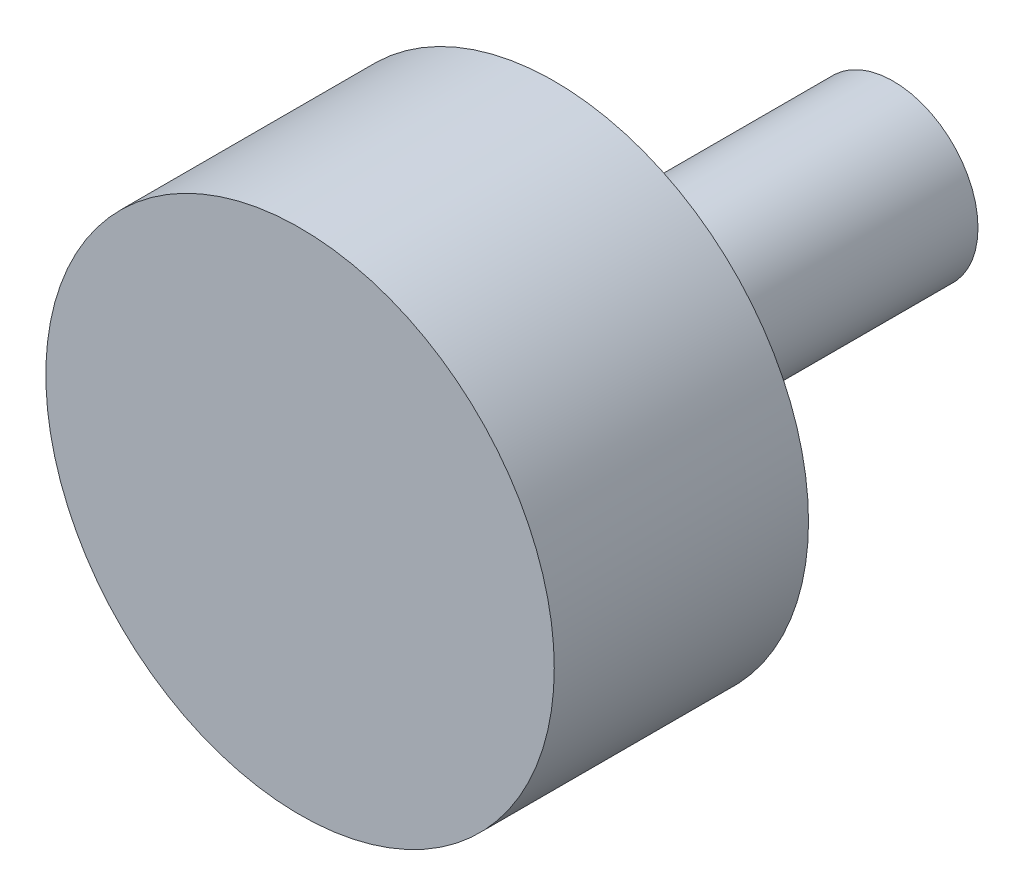
ISO-10303-21;
HEADER;
FILE_DESCRIPTION(('STEP AP214'),'2;1');
FILE_NAME('part.step','',(''),(''),'','','');
FILE_SCHEMA(('AUTOMOTIVE_DESIGN { 1 0 10303 214 1 1 1 1 }'));
ENDSEC;
DATA;
#1=APPLICATION_CONTEXT('core data for automotive mechanical design processes');
#2=APPLICATION_PROTOCOL_DEFINITION('international standard','automotive_design',2000,#1);
#3=PRODUCT_CONTEXT('',#1,'mechanical');
#4=PRODUCT('Part','Part','',(#3));
#5=PRODUCT_RELATED_PRODUCT_CATEGORY('part','',(#4));
#6=PRODUCT_DEFINITION_FORMATION('','',#4);
#7=PRODUCT_DEFINITION_CONTEXT('part definition',#1,'design');
#8=PRODUCT_DEFINITION('design','',#6,#7);
#9=PRODUCT_DEFINITION_SHAPE('','',#8);
#10=(LENGTH_UNIT() NAMED_UNIT(*) SI_UNIT(.MILLI.,.METRE.));
#11=(NAMED_UNIT(*) PLANE_ANGLE_UNIT() SI_UNIT($,.RADIAN.));
#12=(NAMED_UNIT(*) SI_UNIT($,.STERADIAN.) SOLID_ANGLE_UNIT());
#13=UNCERTAINTY_MEASURE_WITH_UNIT(LENGTH_MEASURE(1.E-05),#10,'distance_accuracy_value','');
#14=(GEOMETRIC_REPRESENTATION_CONTEXT(3) GLOBAL_UNCERTAINTY_ASSIGNED_CONTEXT((#13)) GLOBAL_UNIT_ASSIGNED_CONTEXT((#10,
#11,#12)) REPRESENTATION_CONTEXT('',''));
#15=CARTESIAN_POINT('',(0.,0.,0.));
#16=DIRECTION('',(0.,0.,1.));
#17=DIRECTION('',(1.,0.,0.));
#18=AXIS2_PLACEMENT_3D('',#15,#16,#17);
#19=CARTESIAN_POINT('',(0.,0.,-508.));
#20=DIRECTION('',(0.,0.,1.));
#21=DIRECTION('',(1.,0.,0.));
#22=AXIS2_PLACEMENT_3D('',#19,#20,#21);
#23=CYLINDRICAL_SURFACE('',#22,127.);
#24=CARTESIAN_POINT('',(0.,0.,-508.));
#25=DIRECTION('',(0.,0.,1.));
#26=DIRECTION('',(1.,0.,0.));
#27=AXIS2_PLACEMENT_3D('',#24,#25,#26);
#28=CIRCLE('',#27,127.);
#29=CARTESIAN_POINT('',(127.,0.,-508.));
#30=VERTEX_POINT('',#29);
#31=EDGE_CURVE('E53',#30,#30,#28,.T.);
#32=ORIENTED_EDGE('',*,*,#31,.T.);
#33=EDGE_LOOP('',(#32));
#34=FACE_BOUND('',#33,.T.);
#35=CARTESIAN_POINT('',(0.,0.,-50.8));
#36=DIRECTION('',(0.,0.,1.));
#37=DIRECTION('',(1.,0.,0.));
#38=AXIS2_PLACEMENT_3D('',#35,#36,#37);
#39=CIRCLE('',#38,127.);
#40=CARTESIAN_POINT('',(127.,0.,-50.8));
#41=VERTEX_POINT('',#40);
#42=EDGE_CURVE('E10',#41,#41,#39,.T.);
#43=ORIENTED_EDGE('',*,*,#42,.F.);
#44=EDGE_LOOP('',(#43));
#45=FACE_BOUND('',#44,.T.);
#46=ADVANCED_FACE('F34',(#34,#45),#23,.T.);
#47=CARTESIAN_POINT('',(0.,0.,-50.8));
#48=DIRECTION('',(0.,0.,1.));
#49=DIRECTION('',(1.,0.,0.));
#50=AXIS2_PLACEMENT_3D('',#47,#48,#49);
#51=TOROIDAL_SURFACE('',#50,177.8,50.8);
#52=ORIENTED_EDGE('',*,*,#42,.T.);
#53=EDGE_LOOP('',(#52));
#54=FACE_BOUND('',#53,.T.);
#55=CARTESIAN_POINT('',(0.,0.,0.));
#56=DIRECTION('',(0.,0.,1.));
#57=DIRECTION('',(1.,0.,0.));
#58=AXIS2_PLACEMENT_3D('',#55,#56,#57);
#59=CIRCLE('',#58,177.8);
#60=CARTESIAN_POINT('',(177.8,0.,0.));
#61=VERTEX_POINT('',#60);
#62=EDGE_CURVE('E40',#61,#61,#59,.T.);
#63=ORIENTED_EDGE('',*,*,#62,.F.);
#64=EDGE_LOOP('',(#63));
#65=FACE_BOUND('',#64,.T.);
#66=ADVANCED_FACE('F70',(#54,#65),#51,.F.);
#67=CARTESIAN_POINT('',(381.,0.,0.));
#68=DIRECTION('',(0.,0.,-1.));
#69=DIRECTION('',(-1.,0.,0.));
#70=AXIS2_PLACEMENT_3D('',#67,#68,#69);
#71=PLANE('',#70);
#72=ORIENTED_EDGE('',*,*,#62,.T.);
#73=EDGE_LOOP('',(#72));
#74=FACE_BOUND('',#73,.T.);
#75=CARTESIAN_POINT('',(0.,0.,0.));
#76=DIRECTION('',(0.,0.,1.));
#77=DIRECTION('',(1.,0.,0.));
#78=AXIS2_PLACEMENT_3D('',#75,#76,#77);
#79=CIRCLE('',#78,381.);
#80=CARTESIAN_POINT('',(381.,0.,0.));
#81=VERTEX_POINT('',#80);
#82=EDGE_CURVE('E44',#81,#81,#79,.T.);
#83=ORIENTED_EDGE('',*,*,#82,.F.);
#84=EDGE_LOOP('',(#83));
#85=FACE_BOUND('',#84,.T.);
#86=ADVANCED_FACE('F74',(#74,#85),#71,.T.);
#87=CARTESIAN_POINT('',(0.,0.,-508.));
#88=DIRECTION('',(0.,0.,1.));
#89=DIRECTION('',(1.,0.,0.));
#90=AXIS2_PLACEMENT_3D('',#87,#88,#89);
#91=CYLINDRICAL_SURFACE('',#90,381.);
#92=ORIENTED_EDGE('',*,*,#82,.T.);
#93=EDGE_LOOP('',(#92));
#94=FACE_BOUND('',#93,.T.);
#95=CARTESIAN_POINT('',(0.,0.,381.));
#96=DIRECTION('',(0.,0.,1.));
#97=DIRECTION('',(1.,0.,0.));
#98=AXIS2_PLACEMENT_3D('',#95,#96,#97);
#99=CIRCLE('',#98,381.);
#100=CARTESIAN_POINT('',(381.,0.,381.));
#101=VERTEX_POINT('',#100);
#102=EDGE_CURVE('E48',#101,#101,#99,.T.);
#103=ORIENTED_EDGE('',*,*,#102,.F.);
#104=EDGE_LOOP('',(#103));
#105=FACE_BOUND('',#104,.T.);
#106=ADVANCED_FACE('F66',(#94,#105),#91,.T.);
#107=CARTESIAN_POINT('',(0.,0.,381.));
#108=DIRECTION('',(0.,0.,1.));
#109=DIRECTION('',(1.,0.,0.));
#110=AXIS2_PLACEMENT_3D('',#107,#108,#109);
#111=PLANE('',#110);
#112=ORIENTED_EDGE('',*,*,#102,.T.);
#113=EDGE_LOOP('',(#112));
#114=FACE_BOUND('',#113,.T.);
#115=ADVANCED_FACE('F61',(#114),#111,.T.);
#116=CARTESIAN_POINT('',(127.,0.,-508.));
#117=DIRECTION('',(0.,0.,-1.));
#118=DIRECTION('',(-1.,0.,0.));
#119=AXIS2_PLACEMENT_3D('',#116,#117,#118);
#120=PLANE('',#119);
#121=ORIENTED_EDGE('',*,*,#31,.F.);
#122=EDGE_LOOP('',(#121));
#123=FACE_BOUND('',#122,.T.);
#124=ADVANCED_FACE('F59',(#123),#120,.T.);
#125=CLOSED_SHELL('',(#46,#66,#86,#106,#115,#124));
#126=MANIFOLD_SOLID_BREP('B2',#125);
#127=ADVANCED_BREP_SHAPE_REPRESENTATION('',(#18,#126),#14);
#128=SHAPE_DEFINITION_REPRESENTATION(#9,#127);
ENDSEC;
END-ISO-10303-21;
